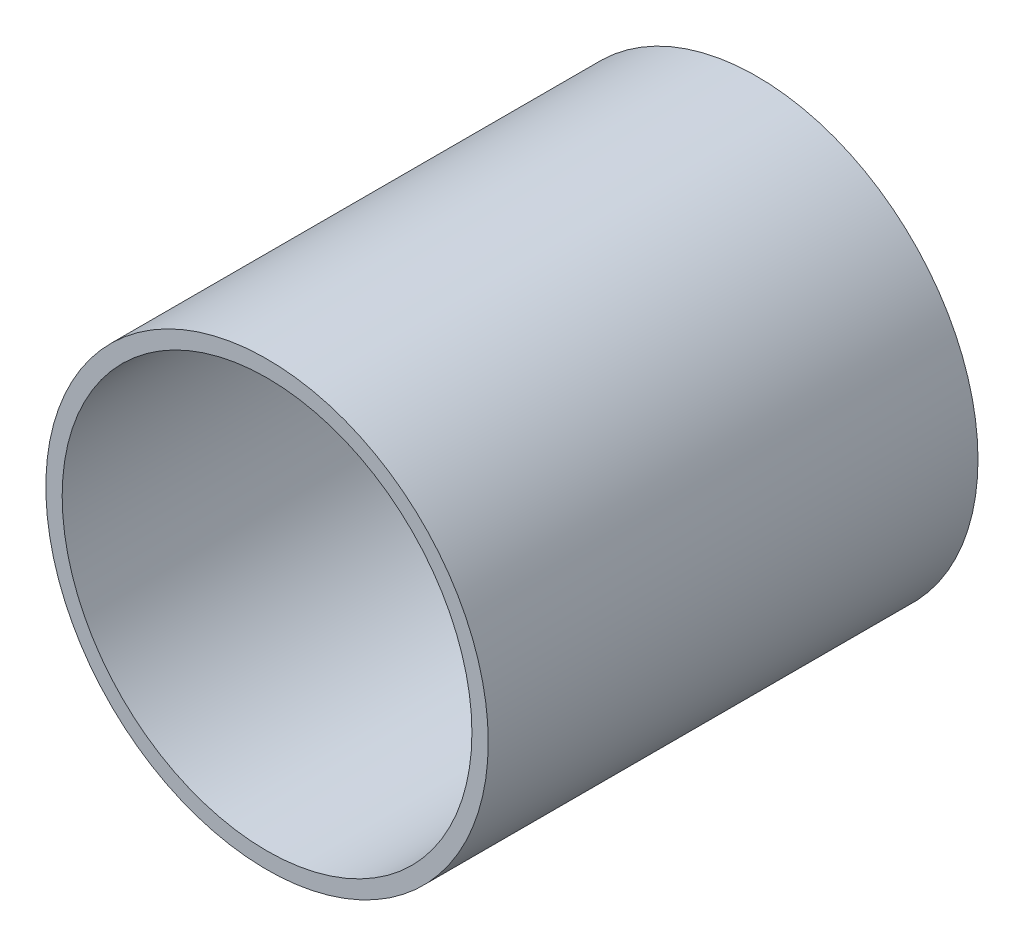
ISO-10303-21;
HEADER;
FILE_DESCRIPTION(('STEP AP214'),'2;1');
FILE_NAME('part.step','',(''),(''),'','','');
FILE_SCHEMA(('AUTOMOTIVE_DESIGN { 1 0 10303 214 1 1 1 1 }'));
ENDSEC;
DATA;
#1=APPLICATION_CONTEXT('core data for automotive mechanical design processes');
#2=APPLICATION_PROTOCOL_DEFINITION('international standard','automotive_design',2000,#1);
#3=PRODUCT_CONTEXT('',#1,'mechanical');
#4=PRODUCT('Part','Part','',(#3));
#5=PRODUCT_RELATED_PRODUCT_CATEGORY('part','',(#4));
#6=PRODUCT_DEFINITION_FORMATION('','',#4);
#7=PRODUCT_DEFINITION_CONTEXT('part definition',#1,'design');
#8=PRODUCT_DEFINITION('design','',#6,#7);
#9=PRODUCT_DEFINITION_SHAPE('','',#8);
#10=(LENGTH_UNIT() NAMED_UNIT(*) SI_UNIT(.MILLI.,.METRE.));
#11=(NAMED_UNIT(*) PLANE_ANGLE_UNIT() SI_UNIT($,.RADIAN.));
#12=(NAMED_UNIT(*) SI_UNIT($,.STERADIAN.) SOLID_ANGLE_UNIT());
#13=UNCERTAINTY_MEASURE_WITH_UNIT(LENGTH_MEASURE(1.E-05),#10,'distance_accuracy_value','');
#14=(GEOMETRIC_REPRESENTATION_CONTEXT(3) GLOBAL_UNCERTAINTY_ASSIGNED_CONTEXT((#13)) GLOBAL_UNIT_ASSIGNED_CONTEXT((#10,
#11,#12)) REPRESENTATION_CONTEXT('',''));
#15=CARTESIAN_POINT('',(0.,0.,0.));
#16=DIRECTION('',(0.,0.,1.));
#17=DIRECTION('',(1.,0.,0.));
#18=AXIS2_PLACEMENT_3D('',#15,#16,#17);
#19=CARTESIAN_POINT('',(0.,0.,30.));
#20=DIRECTION('',(0.,0.,1.));
#21=DIRECTION('',(1.,0.,0.));
#22=AXIS2_PLACEMENT_3D('',#19,#20,#21);
#23=PLANE('',#22);
#24=CARTESIAN_POINT('',(0.,0.,30.));
#25=DIRECTION('',(0.,0.,1.));
#26=DIRECTION('',(1.,0.,0.));
#27=AXIS2_PLACEMENT_3D('',#24,#25,#26);
#28=CIRCLE('',#27,13.55);
#29=CARTESIAN_POINT('',(13.55,0.,30.));
#30=VERTEX_POINT('',#29);
#31=EDGE_CURVE('E10',#30,#30,#28,.T.);
#32=ORIENTED_EDGE('',*,*,#31,.T.);
#33=EDGE_LOOP('',(#32));
#34=FACE_BOUND('',#33,.T.);
#35=CARTESIAN_POINT('',(0.,0.,30.));
#36=DIRECTION('',(0.,0.,1.));
#37=DIRECTION('',(1.,0.,0.));
#38=AXIS2_PLACEMENT_3D('',#35,#36,#37);
#39=CIRCLE('',#38,12.55);
#40=CARTESIAN_POINT('',(12.55,0.,30.));
#41=VERTEX_POINT('',#40);
#42=EDGE_CURVE('E50',#41,#41,#39,.T.);
#43=ORIENTED_EDGE('',*,*,#42,.F.);
#44=EDGE_LOOP('',(#43));
#45=FACE_BOUND('',#44,.T.);
#46=ADVANCED_FACE('F39',(#34,#45),#23,.T.);
#47=CARTESIAN_POINT('',(0.,0.,0.));
#48=DIRECTION('',(0.,0.,1.));
#49=DIRECTION('',(1.,0.,0.));
#50=AXIS2_PLACEMENT_3D('',#47,#48,#49);
#51=PLANE('',#50);
#52=CARTESIAN_POINT('',(0.,0.,0.));
#53=DIRECTION('',(0.,0.,1.));
#54=DIRECTION('',(1.,0.,0.));
#55=AXIS2_PLACEMENT_3D('',#52,#53,#54);
#56=CIRCLE('',#55,13.55);
#57=CARTESIAN_POINT('',(13.55,0.,0.));
#58=VERTEX_POINT('',#57);
#59=EDGE_CURVE('E43',#58,#58,#56,.T.);
#60=ORIENTED_EDGE('',*,*,#59,.F.);
#61=EDGE_LOOP('',(#60));
#62=FACE_BOUND('',#61,.T.);
#63=CARTESIAN_POINT('',(0.,0.,0.));
#64=DIRECTION('',(0.,0.,1.));
#65=DIRECTION('',(1.,0.,0.));
#66=AXIS2_PLACEMENT_3D('',#63,#64,#65);
#67=CIRCLE('',#66,12.55);
#68=CARTESIAN_POINT('',(12.55,0.,0.));
#69=VERTEX_POINT('',#68);
#70=EDGE_CURVE('E52',#69,#69,#67,.T.);
#71=ORIENTED_EDGE('',*,*,#70,.T.);
#72=EDGE_LOOP('',(#71));
#73=FACE_BOUND('',#72,.T.);
#74=ADVANCED_FACE('F62',(#62,#73),#51,.F.);
#75=CARTESIAN_POINT('',(0.,0.,30.));
#76=DIRECTION('',(0.,0.,-1.));
#77=DIRECTION('',(-1.,0.,0.));
#78=AXIS2_PLACEMENT_3D('',#75,#76,#77);
#79=CYLINDRICAL_SURFACE('',#78,13.55);
#80=ORIENTED_EDGE('',*,*,#31,.F.);
#81=EDGE_LOOP('',(#80));
#82=FACE_BOUND('',#81,.T.);
#83=ORIENTED_EDGE('',*,*,#59,.T.);
#84=EDGE_LOOP('',(#83));
#85=FACE_BOUND('',#84,.T.);
#86=ADVANCED_FACE('F41',(#82,#85),#79,.T.);
#87=CARTESIAN_POINT('',(0.,0.,30.));
#88=DIRECTION('',(0.,0.,-1.));
#89=DIRECTION('',(-1.,0.,0.));
#90=AXIS2_PLACEMENT_3D('',#87,#88,#89);
#91=CYLINDRICAL_SURFACE('',#90,12.55);
#92=ORIENTED_EDGE('',*,*,#42,.T.);
#93=EDGE_LOOP('',(#92));
#94=FACE_BOUND('',#93,.T.);
#95=ORIENTED_EDGE('',*,*,#70,.F.);
#96=EDGE_LOOP('',(#95));
#97=FACE_BOUND('',#96,.T.);
#98=ADVANCED_FACE('F58',(#94,#97),#91,.F.);
#99=CLOSED_SHELL('',(#46,#74,#86,#98));
#100=MANIFOLD_SOLID_BREP('B2',#99);
#101=ADVANCED_BREP_SHAPE_REPRESENTATION('',(#18,#100),#14);
#102=SHAPE_DEFINITION_REPRESENTATION(#9,#101);
ENDSEC;
END-ISO-10303-21;
